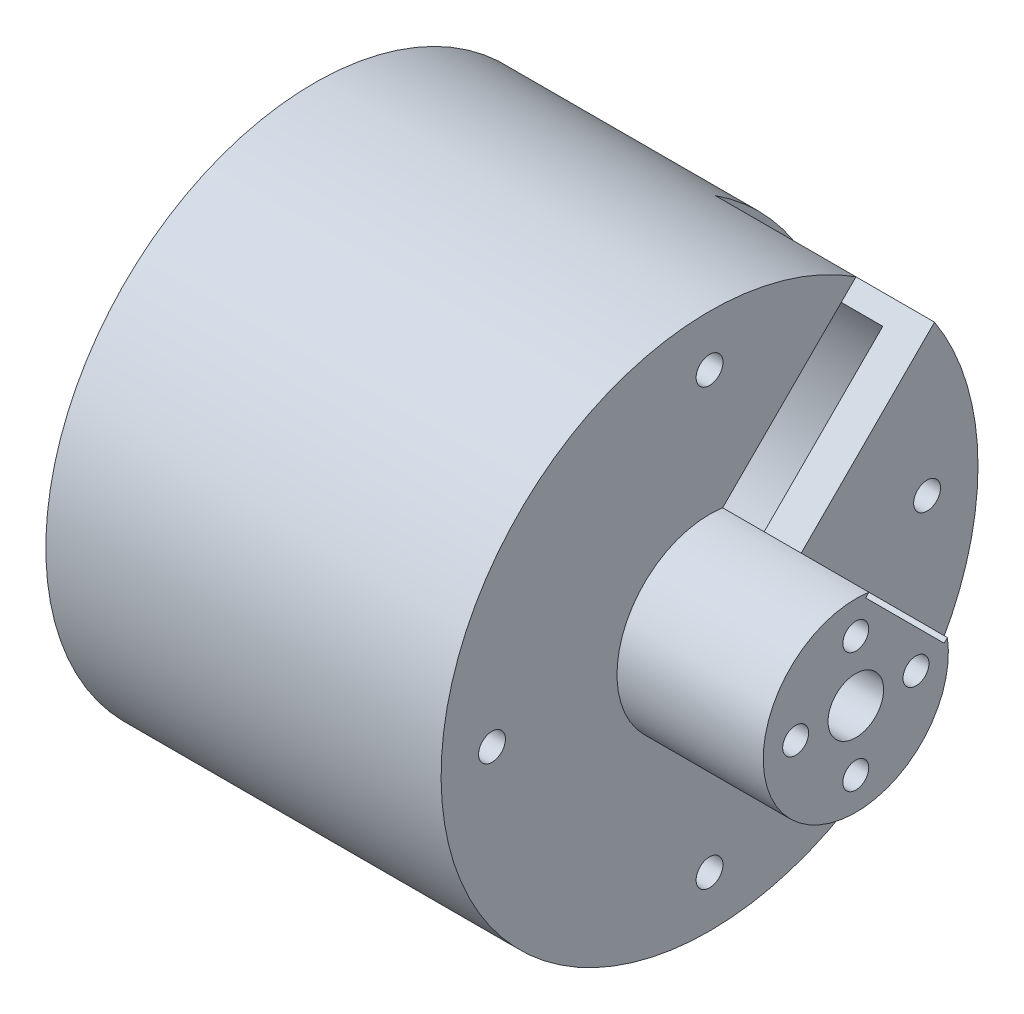
ISO-10303-21;
HEADER;
FILE_DESCRIPTION(('STEP AP214'),'2;1');
FILE_NAME('part.step','',(''),(''),'','','');
FILE_SCHEMA(('AUTOMOTIVE_DESIGN { 1 0 10303 214 1 1 1 1 }'));
ENDSEC;
DATA;
#1=APPLICATION_CONTEXT('core data for automotive mechanical design processes');
#2=APPLICATION_PROTOCOL_DEFINITION('international standard','automotive_design',2000,#1);
#3=PRODUCT_CONTEXT('',#1,'mechanical');
#4=PRODUCT('Part','Part','',(#3));
#5=PRODUCT_RELATED_PRODUCT_CATEGORY('part','',(#4));
#6=PRODUCT_DEFINITION_FORMATION('','',#4);
#7=PRODUCT_DEFINITION_CONTEXT('part definition',#1,'design');
#8=PRODUCT_DEFINITION('design','',#6,#7);
#9=PRODUCT_DEFINITION_SHAPE('','',#8);
#10=(LENGTH_UNIT() NAMED_UNIT(*) SI_UNIT(.MILLI.,.METRE.));
#11=(NAMED_UNIT(*) PLANE_ANGLE_UNIT() SI_UNIT($,.RADIAN.));
#12=(NAMED_UNIT(*) SI_UNIT($,.STERADIAN.) SOLID_ANGLE_UNIT());
#13=UNCERTAINTY_MEASURE_WITH_UNIT(LENGTH_MEASURE(1.E-05),#10,'distance_accuracy_value','');
#14=(GEOMETRIC_REPRESENTATION_CONTEXT(3) GLOBAL_UNCERTAINTY_ASSIGNED_CONTEXT((#13)) GLOBAL_UNIT_ASSIGNED_CONTEXT((#10,
#11,#12)) REPRESENTATION_CONTEXT('',''));
#15=CARTESIAN_POINT('',(0.,0.,0.));
#16=DIRECTION('',(0.,0.,1.));
#17=DIRECTION('',(1.,0.,0.));
#18=AXIS2_PLACEMENT_3D('',#15,#16,#17);
#19=CARTESIAN_POINT('',(-10.123,0.,0.));
#20=DIRECTION('',(-1.,0.,0.));
#21=DIRECTION('',(0.,0.,-1.));
#22=AXIS2_PLACEMENT_3D('',#19,#20,#21);
#23=CYLINDRICAL_SURFACE('',#22,26.8);
#24=CARTESIAN_POINT('',(-21.,0.,0.));
#25=DIRECTION('',(-1.,0.,0.));
#26=DIRECTION('',(0.,0.,1.));
#27=AXIS2_PLACEMENT_3D('',#24,#25,#26);
#28=CIRCLE('',#27,26.8);
#29=CARTESIAN_POINT('',(-21.,0.,26.8));
#30=VERTEX_POINT('',#29);
#31=EDGE_CURVE('E49',#30,#30,#28,.F.);
#32=ORIENTED_EDGE('',*,*,#31,.F.);
#33=EDGE_LOOP('',(#32));
#34=FACE_BOUND('',#33,.T.);
#35=DIRECTION('',(-1.,0.,0.));
#36=VECTOR('',#35,1.);
#37=CARTESIAN_POINT('',(-10.123,22.7120748961036,-14.226793521865));
#38=LINE('',#37,#36);
#39=CARTESIAN_POINT('',(6.,22.7120748961036,-14.226793521865));
#40=VERTEX_POINT('',#39);
#41=CARTESIAN_POINT('',(17.2,22.7120748961036,-14.226793521865));
#42=VERTEX_POINT('',#41);
#43=EDGE_CURVE('E127',#40,#42,#38,.F.);
#44=ORIENTED_EDGE('',*,*,#43,.T.);
#45=CARTESIAN_POINT('',(17.2,0.,0.));
#46=DIRECTION('',(1.,0.,0.));
#47=DIRECTION('',(0.,0.,-1.));
#48=AXIS2_PLACEMENT_3D('',#45,#46,#47);
#49=CIRCLE('',#48,26.8);
#50=CARTESIAN_POINT('',(17.2,14.226793521865,-22.7120748961036));
#51=VERTEX_POINT('',#50);
#52=EDGE_CURVE('E159',#42,#51,#49,.T.);
#53=ORIENTED_EDGE('',*,*,#52,.T.);
#54=DIRECTION('',(-1.,0.,0.));
#55=VECTOR('',#54,1.);
#56=CARTESIAN_POINT('',(-10.123,14.226793521865,-22.7120748961036));
#57=LINE('',#56,#55);
#58=CARTESIAN_POINT('',(6.,14.226793521865,-22.7120748961036));
#59=VERTEX_POINT('',#58);
#60=EDGE_CURVE('E228',#51,#59,#57,.T.);
#61=ORIENTED_EDGE('',*,*,#60,.T.);
#62=CARTESIAN_POINT('',(6.,0.,0.));
#63=DIRECTION('',(1.,0.,0.));
#64=DIRECTION('',(0.,0.,-1.));
#65=AXIS2_PLACEMENT_3D('',#62,#63,#64);
#66=CIRCLE('',#65,26.8);
#67=EDGE_CURVE('E114',#40,#59,#66,.F.);
#68=ORIENTED_EDGE('',*,*,#67,.F.);
#69=EDGE_LOOP('',(#44,#53,#61,#68));
#70=FACE_BOUND('',#69,.T.);
#71=ADVANCED_FACE('F41',(#34,#70),#23,.F.);
#72=CARTESIAN_POINT('',(-10.123,0.,0.));
#73=DIRECTION('',(-1.,0.,0.));
#74=DIRECTION('',(0.,0.,-1.));
#75=AXIS2_PLACEMENT_3D('',#72,#73,#74);
#76=CYLINDRICAL_SURFACE('',#75,29.);
#77=CARTESIAN_POINT('',(-21.5,0.,0.));
#78=DIRECTION('',(1.,0.,0.));
#79=DIRECTION('',(0.,0.,-1.));
#80=AXIS2_PLACEMENT_3D('',#77,#78,#79);
#81=CIRCLE('',#80,29.);
#82=CARTESIAN_POINT('',(-21.5,0.,-29.));
#83=VERTEX_POINT('',#82);
#84=EDGE_CURVE('E143',#83,#83,#81,.T.);
#85=ORIENTED_EDGE('',*,*,#84,.T.);
#86=EDGE_LOOP('',(#85));
#87=FACE_BOUND('',#86,.T.);
#88=DIRECTION('',(-1.,0.,0.));
#89=VECTOR('',#88,1.);
#90=CARTESIAN_POINT('',(-10.123,24.3050433348582,-15.8197619606196));
#91=LINE('',#90,#89);
#92=CARTESIAN_POINT('',(21.2,24.3050433348582,-15.8197619606196));
#93=VERTEX_POINT('',#92);
#94=CARTESIAN_POINT('',(6.,24.3050433348582,-15.8197619606196));
#95=VERTEX_POINT('',#94);
#96=EDGE_CURVE('E131',#93,#95,#91,.T.);
#97=ORIENTED_EDGE('',*,*,#96,.T.);
#98=CARTESIAN_POINT('',(6.,0.,0.));
#99=DIRECTION('',(1.,0.,0.));
#100=DIRECTION('',(0.,0.,-1.));
#101=AXIS2_PLACEMENT_3D('',#98,#99,#100);
#102=CIRCLE('',#101,29.);
#103=CARTESIAN_POINT('',(6.,15.8197619606196,-24.3050433348582));
#104=VERTEX_POINT('',#103);
#105=EDGE_CURVE('E111',#104,#95,#102,.T.);
#106=ORIENTED_EDGE('',*,*,#105,.F.);
#107=DIRECTION('',(-1.,0.,0.));
#108=VECTOR('',#107,1.);
#109=CARTESIAN_POINT('',(-10.123,15.8197619606196,-24.3050433348582));
#110=LINE('',#109,#108);
#111=CARTESIAN_POINT('',(21.2,15.8197619606196,-24.3050433348582));
#112=VERTEX_POINT('',#111);
#113=EDGE_CURVE('E120',#104,#112,#110,.F.);
#114=ORIENTED_EDGE('',*,*,#113,.T.);
#115=CARTESIAN_POINT('',(21.2,0.,0.));
#116=DIRECTION('',(1.,0.,0.));
#117=DIRECTION('',(0.,0.,-1.));
#118=AXIS2_PLACEMENT_3D('',#115,#116,#117);
#119=CIRCLE('',#118,29.);
#120=EDGE_CURVE('E146',#93,#112,#119,.T.);
#121=ORIENTED_EDGE('',*,*,#120,.F.);
#122=EDGE_LOOP('',(#97,#106,#114,#121));
#123=FACE_BOUND('',#122,.T.);
#124=ADVANCED_FACE('F129',(#87,#123),#76,.T.);
#125=CARTESIAN_POINT('',(21.2,29.,0.));
#126=DIRECTION('',(-1.,0.,0.));
#127=DIRECTION('',(0.,0.,-1.));
#128=AXIS2_PLACEMENT_3D('',#125,#126,#127);
#129=PLANE('',#128);
#130=CARTESIAN_POINT('',(21.2,0.,-23.5));
#131=DIRECTION('',(-1.,0.,0.));
#132=DIRECTION('',(0.,0.,1.));
#133=AXIS2_PLACEMENT_3D('',#130,#131,#132);
#134=CIRCLE('',#133,1.45);
#135=CARTESIAN_POINT('',(21.2,0.,-22.05));
#136=VERTEX_POINT('',#135);
#137=EDGE_CURVE('E163',#136,#136,#134,.T.);
#138=ORIENTED_EDGE('',*,*,#137,.T.);
#139=EDGE_LOOP('',(#138));
#140=FACE_BOUND('',#139,.T.);
#141=CARTESIAN_POINT('',(21.2,23.5,-3.33955085807247E-13));
#142=DIRECTION('',(-1.,0.,0.));
#143=DIRECTION('',(0.,-1.,0.));
#144=AXIS2_PLACEMENT_3D('',#141,#142,#143);
#145=CIRCLE('',#144,1.45);
#146=CARTESIAN_POINT('',(21.2,22.05,-3.18767141983279E-13));
#147=VERTEX_POINT('',#146);
#148=EDGE_CURVE('E169',#147,#147,#145,.T.);
#149=ORIENTED_EDGE('',*,*,#148,.T.);
#150=EDGE_LOOP('',(#149));
#151=FACE_BOUND('',#150,.T.);
#152=CARTESIAN_POINT('',(21.2,0.,23.5));
#153=DIRECTION('',(-1.,0.,0.));
#154=DIRECTION('',(0.,0.,-1.));
#155=AXIS2_PLACEMENT_3D('',#152,#153,#154);
#156=CIRCLE('',#155,1.45);
#157=CARTESIAN_POINT('',(21.2,0.,22.05));
#158=VERTEX_POINT('',#157);
#159=EDGE_CURVE('E176',#158,#158,#156,.T.);
#160=ORIENTED_EDGE('',*,*,#159,.T.);
#161=EDGE_LOOP('',(#160));
#162=FACE_BOUND('',#161,.T.);
#163=CARTESIAN_POINT('',(21.2,-23.5,1.6985546288162E-13));
#164=DIRECTION('',(-1.,0.,0.));
#165=DIRECTION('',(0.,1.,0.));
#166=AXIS2_PLACEMENT_3D('',#163,#164,#165);
#167=CIRCLE('',#166,1.45);
#168=CARTESIAN_POINT('',(21.2,-22.05,1.64792814940297E-13));
#169=VERTEX_POINT('',#168);
#170=EDGE_CURVE('E182',#169,#169,#167,.T.);
#171=ORIENTED_EDGE('',*,*,#170,.T.);
#172=EDGE_LOOP('',(#171));
#173=FACE_BOUND('',#172,.T.);
#174=DIRECTION('',(0.,0.707106781186548,-0.707106781186548));
#175=VECTOR('',#174,1.);
#176=CARTESIAN_POINT('',(21.2,18.7426406871193,-10.2573593128807));
#177=LINE('',#176,#175);
#178=CARTESIAN_POINT('',(21.2,9.89949493661167,-1.4142135623731));
#179=VERTEX_POINT('',#178);
#180=EDGE_CURVE('E215',#179,#93,#177,.T.);
#181=ORIENTED_EDGE('',*,*,#180,.T.);
#182=ORIENTED_EDGE('',*,*,#120,.T.);
#183=DIRECTION('',(0.,-0.707106781186548,0.707106781186547));
#184=VECTOR('',#183,1.);
#185=CARTESIAN_POINT('',(21.2,10.2573593128807,-18.7426406871193));
#186=LINE('',#185,#184);
#187=CARTESIAN_POINT('',(21.2,1.41421356237309,-9.89949493661167));
#188=VERTEX_POINT('',#187);
#189=EDGE_CURVE('E123',#112,#188,#186,.T.);
#190=ORIENTED_EDGE('',*,*,#189,.T.);
#191=CARTESIAN_POINT('',(21.2,0.,0.));
#192=DIRECTION('',(1.,0.,0.));
#193=DIRECTION('',(0.,0.,-1.));
#194=AXIS2_PLACEMENT_3D('',#191,#192,#193);
#195=CIRCLE('',#194,10.);
#196=EDGE_CURVE('E148',#179,#188,#195,.T.);
#197=ORIENTED_EDGE('',*,*,#196,.F.);
#198=EDGE_LOOP('',(#181,#182,#190,#197));
#199=FACE_BOUND('',#198,.T.);
#200=ADVANCED_FACE('F251',(#140,#151,#162,#173,#199),#129,.F.);
#201=CARTESIAN_POINT('',(-10.123,0.,0.));
#202=DIRECTION('',(-1.,0.,0.));
#203=DIRECTION('',(0.,0.,-1.));
#204=AXIS2_PLACEMENT_3D('',#201,#202,#203);
#205=CYLINDRICAL_SURFACE('',#204,10.);
#206=DIRECTION('',(-1.,0.,0.));
#207=VECTOR('',#206,1.);
#208=CARTESIAN_POINT('',(-10.123,9.89949493661167,-1.4142135623731));
#209=LINE('',#208,#207);
#210=CARTESIAN_POINT('',(37.,9.89949493661167,-1.4142135623731));
#211=VERTEX_POINT('',#210);
#212=EDGE_CURVE('E217',#211,#179,#209,.T.);
#213=ORIENTED_EDGE('',*,*,#212,.T.);
#214=ORIENTED_EDGE('',*,*,#196,.T.);
#215=DIRECTION('',(-1.,0.,0.));
#216=VECTOR('',#215,1.);
#217=CARTESIAN_POINT('',(-10.123,1.41421356237309,-9.89949493661167));
#218=LINE('',#217,#216);
#219=CARTESIAN_POINT('',(37.,1.41421356237309,-9.89949493661167));
#220=VERTEX_POINT('',#219);
#221=EDGE_CURVE('E224',#188,#220,#218,.F.);
#222=ORIENTED_EDGE('',*,*,#221,.T.);
#223=CARTESIAN_POINT('',(37.,0.,0.));
#224=DIRECTION('',(1.,0.,0.));
#225=DIRECTION('',(0.,0.,-1.));
#226=AXIS2_PLACEMENT_3D('',#223,#224,#225);
#227=CIRCLE('',#226,10.);
#228=EDGE_CURVE('E151',#211,#220,#227,.T.);
#229=ORIENTED_EDGE('',*,*,#228,.F.);
#230=EDGE_LOOP('',(#213,#214,#222,#229));
#231=FACE_BOUND('',#230,.T.);
#232=ADVANCED_FACE('F249',(#231),#205,.T.);
#233=CARTESIAN_POINT('',(37.,10.,0.));
#234=DIRECTION('',(-1.,0.,0.));
#235=DIRECTION('',(0.,0.,-1.));
#236=AXIS2_PLACEMENT_3D('',#233,#234,#235);
#237=PLANE('',#236);
#238=CARTESIAN_POINT('',(37.,0.,0.));
#239=DIRECTION('',(1.,0.,0.));
#240=DIRECTION('',(0.,0.,-1.));
#241=AXIS2_PLACEMENT_3D('',#238,#239,#240);
#242=CIRCLE('',#241,3.);
#243=CARTESIAN_POINT('',(37.,0.,-3.));
#244=VERTEX_POINT('',#243);
#245=EDGE_CURVE('E153',#244,#244,#242,.T.);
#246=ORIENTED_EDGE('',*,*,#245,.F.);
#247=EDGE_LOOP('',(#246));
#248=FACE_BOUND('',#247,.T.);
#249=CARTESIAN_POINT('',(37.,0.,-6.5));
#250=DIRECTION('',(-1.,0.,0.));
#251=DIRECTION('',(0.,0.,1.));
#252=AXIS2_PLACEMENT_3D('',#249,#250,#251);
#253=CIRCLE('',#252,1.4);
#254=CARTESIAN_POINT('',(37.,0.,-5.1));
#255=VERTEX_POINT('',#254);
#256=EDGE_CURVE('E187',#255,#255,#253,.T.);
#257=ORIENTED_EDGE('',*,*,#256,.T.);
#258=EDGE_LOOP('',(#257));
#259=FACE_BOUND('',#258,.T.);
#260=CARTESIAN_POINT('',(37.,6.5,0.));
#261=DIRECTION('',(-1.,0.,0.));
#262=DIRECTION('',(0.,-1.,0.));
#263=AXIS2_PLACEMENT_3D('',#260,#261,#262);
#264=CIRCLE('',#263,1.4);
#265=CARTESIAN_POINT('',(37.,5.1,0.));
#266=VERTEX_POINT('',#265);
#267=EDGE_CURVE('E193',#266,#266,#264,.T.);
#268=ORIENTED_EDGE('',*,*,#267,.T.);
#269=EDGE_LOOP('',(#268));
#270=FACE_BOUND('',#269,.T.);
#271=CARTESIAN_POINT('',(37.,0.,6.5));
#272=DIRECTION('',(-1.,0.,0.));
#273=DIRECTION('',(0.,0.,-1.));
#274=AXIS2_PLACEMENT_3D('',#271,#272,#273);
#275=CIRCLE('',#274,1.4);
#276=CARTESIAN_POINT('',(37.,0.,5.1));
#277=VERTEX_POINT('',#276);
#278=EDGE_CURVE('E199',#277,#277,#275,.T.);
#279=ORIENTED_EDGE('',*,*,#278,.T.);
#280=EDGE_LOOP('',(#279));
#281=FACE_BOUND('',#280,.T.);
#282=CARTESIAN_POINT('',(37.,-6.5,0.));
#283=DIRECTION('',(-1.,0.,0.));
#284=DIRECTION('',(0.,1.,0.));
#285=AXIS2_PLACEMENT_3D('',#282,#283,#284);
#286=CIRCLE('',#285,1.4);
#287=CARTESIAN_POINT('',(37.,-5.1,0.));
#288=VERTEX_POINT('',#287);
#289=EDGE_CURVE('E205',#288,#288,#286,.T.);
#290=ORIENTED_EDGE('',*,*,#289,.T.);
#291=EDGE_LOOP('',(#290));
#292=FACE_BOUND('',#291,.T.);
#293=DIRECTION('',(0.,0.707106781186548,-0.707106781186548));
#294=VECTOR('',#293,1.);
#295=CARTESIAN_POINT('',(37.,9.24264068711928,-0.757359312880718));
#296=LINE('',#295,#294);
#297=CARTESIAN_POINT('',(37.,9.54594154601839,-1.06066017177982));
#298=VERTEX_POINT('',#297);
#299=EDGE_CURVE('E219',#298,#211,#296,.T.);
#300=ORIENTED_EDGE('',*,*,#299,.T.);
#301=ORIENTED_EDGE('',*,*,#228,.T.);
#302=DIRECTION('',(0.,-0.707106781186548,0.707106781186547));
#303=VECTOR('',#302,1.);
#304=CARTESIAN_POINT('',(37.,0.757359312880715,-9.24264068711929));
#305=LINE('',#304,#303);
#306=CARTESIAN_POINT('',(37.,1.06066017177982,-9.54594154601839));
#307=VERTEX_POINT('',#306);
#308=EDGE_CURVE('E56',#220,#307,#305,.T.);
#309=ORIENTED_EDGE('',*,*,#308,.T.);
#310=DIRECTION('',(0.,0.707106781186548,0.707106781186548));
#311=VECTOR('',#310,1.);
#312=CARTESIAN_POINT('',(37.,10.3033008588991,-0.303300858899107));
#313=LINE('',#312,#311);
#314=EDGE_CURVE('E211',#307,#298,#313,.T.);
#315=ORIENTED_EDGE('',*,*,#314,.T.);
#316=EDGE_LOOP('',(#300,#301,#309,#315));
#317=FACE_BOUND('',#316,.T.);
#318=ADVANCED_FACE('F244',(#248,#259,#270,#281,#292,#317),#237,.F.);
#319=CARTESIAN_POINT('',(17.2,3.,0.));
#320=DIRECTION('',(1.,0.,0.));
#321=DIRECTION('',(0.,0.,1.));
#322=AXIS2_PLACEMENT_3D('',#319,#320,#321);
#323=PLANE('',#322);
#324=CARTESIAN_POINT('',(17.2,0.,0.));
#325=DIRECTION('',(1.,0.,0.));
#326=DIRECTION('',(0.,0.,-1.));
#327=AXIS2_PLACEMENT_3D('',#324,#325,#326);
#328=CIRCLE('',#327,3.);
#329=CARTESIAN_POINT('',(17.2,0.,-3.));
#330=VERTEX_POINT('',#329);
#331=EDGE_CURVE('E156',#330,#330,#328,.T.);
#332=ORIENTED_EDGE('',*,*,#331,.T.);
#333=EDGE_LOOP('',(#332));
#334=FACE_BOUND('',#333,.T.);
#335=CARTESIAN_POINT('',(17.2,0.,-23.5));
#336=DIRECTION('',(-1.,0.,0.));
#337=DIRECTION('',(0.,0.,1.));
#338=AXIS2_PLACEMENT_3D('',#335,#336,#337);
#339=CIRCLE('',#338,1.45);
#340=CARTESIAN_POINT('',(17.2,0.,-22.05));
#341=VERTEX_POINT('',#340);
#342=EDGE_CURVE('E162',#341,#341,#339,.T.);
#343=ORIENTED_EDGE('',*,*,#342,.F.);
#344=EDGE_LOOP('',(#343));
#345=FACE_BOUND('',#344,.T.);
#346=CARTESIAN_POINT('',(17.2,23.5,-3.33955085807247E-13));
#347=DIRECTION('',(-1.,0.,0.));
#348=DIRECTION('',(0.,-1.,0.));
#349=AXIS2_PLACEMENT_3D('',#346,#347,#348);
#350=CIRCLE('',#349,1.45);
#351=CARTESIAN_POINT('',(17.2,22.05,-3.18767141983279E-13));
#352=VERTEX_POINT('',#351);
#353=EDGE_CURVE('E172',#352,#352,#350,.T.);
#354=ORIENTED_EDGE('',*,*,#353,.F.);
#355=EDGE_LOOP('',(#354));
#356=FACE_BOUND('',#355,.T.);
#357=CARTESIAN_POINT('',(17.2,0.,23.5));
#358=DIRECTION('',(-1.,0.,0.));
#359=DIRECTION('',(0.,0.,-1.));
#360=AXIS2_PLACEMENT_3D('',#357,#358,#359);
#361=CIRCLE('',#360,1.45);
#362=CARTESIAN_POINT('',(17.2,0.,22.05));
#363=VERTEX_POINT('',#362);
#364=EDGE_CURVE('E179',#363,#363,#361,.T.);
#365=ORIENTED_EDGE('',*,*,#364,.F.);
#366=EDGE_LOOP('',(#365));
#367=FACE_BOUND('',#366,.T.);
#368=CARTESIAN_POINT('',(17.2,-23.5,1.6985546288162E-13));
#369=DIRECTION('',(-1.,0.,0.));
#370=DIRECTION('',(0.,1.,0.));
#371=AXIS2_PLACEMENT_3D('',#368,#369,#370);
#372=CIRCLE('',#371,1.45);
#373=CARTESIAN_POINT('',(17.2,-22.05,1.64792814940297E-13));
#374=VERTEX_POINT('',#373);
#375=EDGE_CURVE('E166',#374,#374,#372,.T.);
#376=ORIENTED_EDGE('',*,*,#375,.F.);
#377=EDGE_LOOP('',(#376));
#378=FACE_BOUND('',#377,.T.);
#379=DIRECTION('',(0.,-0.707106781186548,0.707106781186548));
#380=VECTOR('',#379,1.);
#381=CARTESIAN_POINT('',(17.2,5.74264068711928,2.74264068711928));
#382=LINE('',#381,#380);
#383=CARTESIAN_POINT('',(17.2,9.54594154601839,-1.06066017177982));
#384=VERTEX_POINT('',#383);
#385=EDGE_CURVE('E132',#42,#384,#382,.T.);
#386=ORIENTED_EDGE('',*,*,#385,.T.);
#387=DIRECTION('',(0.,-0.707106781186548,-0.707106781186548));
#388=VECTOR('',#387,1.);
#389=CARTESIAN_POINT('',(17.2,6.80330085889911,-3.80330085889911));
#390=LINE('',#389,#388);
#391=CARTESIAN_POINT('',(17.2,1.06066017177982,-9.54594154601839));
#392=VERTEX_POINT('',#391);
#393=EDGE_CURVE('E136',#384,#392,#390,.T.);
#394=ORIENTED_EDGE('',*,*,#393,.T.);
#395=DIRECTION('',(0.,0.707106781186548,-0.707106781186547));
#396=VECTOR('',#395,1.);
#397=CARTESIAN_POINT('',(17.2,-2.74264068711929,-5.74264068711929));
#398=LINE('',#397,#396);
#399=EDGE_CURVE('E141',#392,#51,#398,.T.);
#400=ORIENTED_EDGE('',*,*,#399,.T.);
#401=ORIENTED_EDGE('',*,*,#52,.F.);
#402=EDGE_LOOP('',(#386,#394,#400,#401));
#403=FACE_BOUND('',#402,.T.);
#404=ADVANCED_FACE('F240',(#334,#345,#356,#367,#378,#403),#323,.F.);
#405=CARTESIAN_POINT('',(-21.5,26.8,0.));
#406=DIRECTION('',(1.,0.,0.));
#407=DIRECTION('',(0.,0.,1.));
#408=AXIS2_PLACEMENT_3D('',#405,#406,#407);
#409=PLANE('',#408);
#410=CARTESIAN_POINT('',(-21.5,0.,0.));
#411=DIRECTION('',(-1.,0.,0.));
#412=DIRECTION('',(0.,0.,1.));
#413=AXIS2_PLACEMENT_3D('',#410,#411,#412);
#414=CIRCLE('',#413,27.3);
#415=CARTESIAN_POINT('',(-21.5,0.,27.3));
#416=VERTEX_POINT('',#415);
#417=EDGE_CURVE('E11',#416,#416,#414,.T.);
#418=ORIENTED_EDGE('',*,*,#417,.F.);
#419=EDGE_LOOP('',(#418));
#420=FACE_BOUND('',#419,.T.);
#421=ORIENTED_EDGE('',*,*,#84,.F.);
#422=EDGE_LOOP('',(#421));
#423=FACE_BOUND('',#422,.T.);
#424=ADVANCED_FACE('F269',(#420,#423),#409,.F.);
#425=CARTESIAN_POINT('',(-10.123,0.,0.));
#426=DIRECTION('',(-1.,0.,0.));
#427=DIRECTION('',(0.,0.,-1.));
#428=AXIS2_PLACEMENT_3D('',#425,#426,#427);
#429=CYLINDRICAL_SURFACE('',#428,3.);
#430=ORIENTED_EDGE('',*,*,#245,.T.);
#431=EDGE_LOOP('',(#430));
#432=FACE_BOUND('',#431,.T.);
#433=ORIENTED_EDGE('',*,*,#331,.F.);
#434=EDGE_LOOP('',(#433));
#435=FACE_BOUND('',#434,.T.);
#436=ADVANCED_FACE('F271',(#432,#435),#429,.F.);
#437=CARTESIAN_POINT('',(17.2,0.,-23.5));
#438=DIRECTION('',(1.,0.,0.));
#439=DIRECTION('',(0.,0.,1.));
#440=AXIS2_PLACEMENT_3D('',#437,#438,#439);
#441=CYLINDRICAL_SURFACE('',#440,1.45);
#442=ORIENTED_EDGE('',*,*,#342,.T.);
#443=EDGE_LOOP('',(#442));
#444=FACE_BOUND('',#443,.T.);
#445=ORIENTED_EDGE('',*,*,#137,.F.);
#446=EDGE_LOOP('',(#445));
#447=FACE_BOUND('',#446,.T.);
#448=ADVANCED_FACE('F277',(#444,#447),#441,.F.);
#449=CARTESIAN_POINT('',(17.2,23.5,-3.33955085807247E-13));
#450=DIRECTION('',(1.,0.,0.));
#451=DIRECTION('',(0.,0.,1.));
#452=AXIS2_PLACEMENT_3D('',#449,#450,#451);
#453=CYLINDRICAL_SURFACE('',#452,1.45);
#454=ORIENTED_EDGE('',*,*,#353,.T.);
#455=EDGE_LOOP('',(#454));
#456=FACE_BOUND('',#455,.T.);
#457=ORIENTED_EDGE('',*,*,#148,.F.);
#458=EDGE_LOOP('',(#457));
#459=FACE_BOUND('',#458,.T.);
#460=ADVANCED_FACE('F339',(#456,#459),#453,.F.);
#461=CARTESIAN_POINT('',(17.2,0.,23.5));
#462=DIRECTION('',(1.,0.,0.));
#463=DIRECTION('',(0.,0.,1.));
#464=AXIS2_PLACEMENT_3D('',#461,#462,#463);
#465=CYLINDRICAL_SURFACE('',#464,1.45);
#466=ORIENTED_EDGE('',*,*,#364,.T.);
#467=EDGE_LOOP('',(#466));
#468=FACE_BOUND('',#467,.T.);
#469=ORIENTED_EDGE('',*,*,#159,.F.);
#470=EDGE_LOOP('',(#469));
#471=FACE_BOUND('',#470,.T.);
#472=ADVANCED_FACE('F335',(#468,#471),#465,.F.);
#473=CARTESIAN_POINT('',(17.2,-23.5,1.6985546288162E-13));
#474=DIRECTION('',(1.,0.,0.));
#475=DIRECTION('',(0.,0.,1.));
#476=AXIS2_PLACEMENT_3D('',#473,#474,#475);
#477=CYLINDRICAL_SURFACE('',#476,1.45);
#478=ORIENTED_EDGE('',*,*,#375,.T.);
#479=EDGE_LOOP('',(#478));
#480=FACE_BOUND('',#479,.T.);
#481=ORIENTED_EDGE('',*,*,#170,.F.);
#482=EDGE_LOOP('',(#481));
#483=FACE_BOUND('',#482,.T.);
#484=ADVANCED_FACE('F331',(#480,#483),#477,.F.);
#485=CARTESIAN_POINT('',(25.,0.,-6.5));
#486=DIRECTION('',(1.,0.,0.));
#487=DIRECTION('',(0.,0.,1.));
#488=AXIS2_PLACEMENT_3D('',#485,#486,#487);
#489=CYLINDRICAL_SURFACE('',#488,1.4);
#490=CARTESIAN_POINT('',(25.,0.,-6.5));
#491=DIRECTION('',(-1.,0.,0.));
#492=DIRECTION('',(0.,0.,1.));
#493=AXIS2_PLACEMENT_3D('',#490,#491,#492);
#494=CIRCLE('',#493,1.4);
#495=CARTESIAN_POINT('',(25.,0.,-5.1));
#496=VERTEX_POINT('',#495);
#497=EDGE_CURVE('E173',#496,#496,#494,.T.);
#498=ORIENTED_EDGE('',*,*,#497,.T.);
#499=EDGE_LOOP('',(#498));
#500=FACE_BOUND('',#499,.T.);
#501=ORIENTED_EDGE('',*,*,#256,.F.);
#502=EDGE_LOOP('',(#501));
#503=FACE_BOUND('',#502,.T.);
#504=ADVANCED_FACE('F327',(#500,#503),#489,.F.);
#505=CARTESIAN_POINT('',(25.,0.,-6.5));
#506=DIRECTION('',(1.,0.,0.));
#507=DIRECTION('',(0.,0.,1.));
#508=AXIS2_PLACEMENT_3D('',#505,#506,#507);
#509=PLANE('',#508);
#510=ORIENTED_EDGE('',*,*,#497,.F.);
#511=EDGE_LOOP('',(#510));
#512=FACE_BOUND('',#511,.T.);
#513=ADVANCED_FACE('F323',(#512),#509,.T.);
#514=CARTESIAN_POINT('',(25.,6.5,0.));
#515=DIRECTION('',(1.,0.,0.));
#516=DIRECTION('',(0.,0.,1.));
#517=AXIS2_PLACEMENT_3D('',#514,#515,#516);
#518=CYLINDRICAL_SURFACE('',#517,1.4);
#519=CARTESIAN_POINT('',(25.,6.5,0.));
#520=DIRECTION('',(-1.,0.,0.));
#521=DIRECTION('',(0.,-1.,0.));
#522=AXIS2_PLACEMENT_3D('',#519,#520,#521);
#523=CIRCLE('',#522,1.4);
#524=CARTESIAN_POINT('',(25.,5.1,0.));
#525=VERTEX_POINT('',#524);
#526=EDGE_CURVE('E196',#525,#525,#523,.T.);
#527=ORIENTED_EDGE('',*,*,#526,.T.);
#528=EDGE_LOOP('',(#527));
#529=FACE_BOUND('',#528,.T.);
#530=ORIENTED_EDGE('',*,*,#267,.F.);
#531=EDGE_LOOP('',(#530));
#532=FACE_BOUND('',#531,.T.);
#533=ADVANCED_FACE('F319',(#529,#532),#518,.F.);
#534=CARTESIAN_POINT('',(25.,6.5,0.));
#535=DIRECTION('',(1.,0.,0.));
#536=DIRECTION('',(0.,-1.,0.));
#537=AXIS2_PLACEMENT_3D('',#534,#535,#536);
#538=PLANE('',#537);
#539=ORIENTED_EDGE('',*,*,#526,.F.);
#540=EDGE_LOOP('',(#539));
#541=FACE_BOUND('',#540,.T.);
#542=ADVANCED_FACE('F315',(#541),#538,.T.);
#543=CARTESIAN_POINT('',(25.,0.,6.5));
#544=DIRECTION('',(1.,0.,0.));
#545=DIRECTION('',(0.,0.,1.));
#546=AXIS2_PLACEMENT_3D('',#543,#544,#545);
#547=CYLINDRICAL_SURFACE('',#546,1.4);
#548=CARTESIAN_POINT('',(25.,0.,6.5));
#549=DIRECTION('',(-1.,0.,0.));
#550=DIRECTION('',(0.,0.,-1.));
#551=AXIS2_PLACEMENT_3D('',#548,#549,#550);
#552=CIRCLE('',#551,1.4);
#553=CARTESIAN_POINT('',(25.,0.,5.1));
#554=VERTEX_POINT('',#553);
#555=EDGE_CURVE('E202',#554,#554,#552,.T.);
#556=ORIENTED_EDGE('',*,*,#555,.T.);
#557=EDGE_LOOP('',(#556));
#558=FACE_BOUND('',#557,.T.);
#559=ORIENTED_EDGE('',*,*,#278,.F.);
#560=EDGE_LOOP('',(#559));
#561=FACE_BOUND('',#560,.T.);
#562=ADVANCED_FACE('F311',(#558,#561),#547,.F.);
#563=CARTESIAN_POINT('',(25.,0.,6.5));
#564=DIRECTION('',(1.,0.,0.));
#565=DIRECTION('',(0.,0.,-1.));
#566=AXIS2_PLACEMENT_3D('',#563,#564,#565);
#567=PLANE('',#566);
#568=ORIENTED_EDGE('',*,*,#555,.F.);
#569=EDGE_LOOP('',(#568));
#570=FACE_BOUND('',#569,.T.);
#571=ADVANCED_FACE('F307',(#570),#567,.T.);
#572=CARTESIAN_POINT('',(25.,-6.5,0.));
#573=DIRECTION('',(1.,0.,0.));
#574=DIRECTION('',(0.,0.,1.));
#575=AXIS2_PLACEMENT_3D('',#572,#573,#574);
#576=CYLINDRICAL_SURFACE('',#575,1.4);
#577=CARTESIAN_POINT('',(25.,-6.5,0.));
#578=DIRECTION('',(-1.,0.,0.));
#579=DIRECTION('',(0.,1.,0.));
#580=AXIS2_PLACEMENT_3D('',#577,#578,#579);
#581=CIRCLE('',#580,1.4);
#582=CARTESIAN_POINT('',(25.,-5.1,0.));
#583=VERTEX_POINT('',#582);
#584=EDGE_CURVE('E190',#583,#583,#581,.T.);
#585=ORIENTED_EDGE('',*,*,#584,.T.);
#586=EDGE_LOOP('',(#585));
#587=FACE_BOUND('',#586,.T.);
#588=ORIENTED_EDGE('',*,*,#289,.F.);
#589=EDGE_LOOP('',(#588));
#590=FACE_BOUND('',#589,.T.);
#591=ADVANCED_FACE('F303',(#587,#590),#576,.F.);
#592=CARTESIAN_POINT('',(25.,-6.5,0.));
#593=DIRECTION('',(1.,0.,0.));
#594=DIRECTION('',(0.,1.,0.));
#595=AXIS2_PLACEMENT_3D('',#592,#593,#594);
#596=PLANE('',#595);
#597=ORIENTED_EDGE('',*,*,#584,.F.);
#598=EDGE_LOOP('',(#597));
#599=FACE_BOUND('',#598,.T.);
#600=ADVANCED_FACE('F300',(#599),#596,.T.);
#601=CARTESIAN_POINT('',(6.,0.,0.));
#602=DIRECTION('',(-1.,0.,0.));
#603=DIRECTION('',(0.,0.,-1.));
#604=AXIS2_PLACEMENT_3D('',#601,#602,#603);
#605=PLANE('',#604);
#606=DIRECTION('',(0.,0.707106781186548,-0.707106781186548));
#607=VECTOR('',#606,1.);
#608=CARTESIAN_POINT('',(6.,28.9913780286484,-20.5060966544099));
#609=LINE('',#608,#607);
#610=EDGE_CURVE('E117',#40,#95,#609,.T.);
#611=ORIENTED_EDGE('',*,*,#610,.F.);
#612=ORIENTED_EDGE('',*,*,#67,.T.);
#613=DIRECTION('',(0.,-0.707106781186548,0.707106781186547));
#614=VECTOR('',#613,1.);
#615=CARTESIAN_POINT('',(6.,1.06066017177982,-9.54594154601839));
#616=LINE('',#615,#614);
#617=EDGE_CURVE('E107',#104,#59,#616,.T.);
#618=ORIENTED_EDGE('',*,*,#617,.F.);
#619=ORIENTED_EDGE('',*,*,#105,.T.);
#620=EDGE_LOOP('',(#611,#612,#618,#619));
#621=FACE_BOUND('',#620,.T.);
#622=ADVANCED_FACE('F109',(#621),#605,.F.);
#623=CARTESIAN_POINT('',(37.1,9.54594154601839,-1.06066017177982));
#624=DIRECTION('',(0.,0.707106781186548,-0.707106781186548));
#625=DIRECTION('',(0.,-0.707106781186548,-0.707106781186548));
#626=AXIS2_PLACEMENT_3D('',#623,#624,#625);
#627=PLANE('',#626);
#628=ORIENTED_EDGE('',*,*,#314,.F.);
#629=DIRECTION('',(-1.,0.,0.));
#630=VECTOR('',#629,1.);
#631=CARTESIAN_POINT('',(37.1,1.06066017177982,-9.54594154601839));
#632=LINE('',#631,#630);
#633=EDGE_CURVE('E63',#307,#392,#632,.T.);
#634=ORIENTED_EDGE('',*,*,#633,.T.);
#635=ORIENTED_EDGE('',*,*,#393,.F.);
#636=DIRECTION('',(-1.,0.,0.));
#637=VECTOR('',#636,1.);
#638=CARTESIAN_POINT('',(37.1,9.54594154601839,-1.06066017177982));
#639=LINE('',#638,#637);
#640=EDGE_CURVE('E230',#298,#384,#639,.T.);
#641=ORIENTED_EDGE('',*,*,#640,.F.);
#642=EDGE_LOOP('',(#628,#634,#635,#641));
#643=FACE_BOUND('',#642,.T.);
#644=ADVANCED_FACE('F241',(#643),#627,.T.);
#645=CARTESIAN_POINT('',(37.1,28.9913780286484,-20.5060966544099));
#646=DIRECTION('',(0.,-0.707106781186548,-0.707106781186548));
#647=DIRECTION('',(0.,-0.707106781186548,0.707106781186548));
#648=AXIS2_PLACEMENT_3D('',#645,#646,#647);
#649=PLANE('',#648);
#650=ORIENTED_EDGE('',*,*,#96,.F.);
#651=ORIENTED_EDGE('',*,*,#180,.F.);
#652=ORIENTED_EDGE('',*,*,#212,.F.);
#653=ORIENTED_EDGE('',*,*,#299,.F.);
#654=ORIENTED_EDGE('',*,*,#640,.T.);
#655=ORIENTED_EDGE('',*,*,#385,.F.);
#656=ORIENTED_EDGE('',*,*,#43,.F.);
#657=ORIENTED_EDGE('',*,*,#610,.T.);
#658=EDGE_LOOP('',(#650,#651,#652,#653,#654,#655,#656,#657));
#659=FACE_BOUND('',#658,.T.);
#660=ADVANCED_FACE('F235',(#659),#649,.T.);
#661=CARTESIAN_POINT('',(37.1,1.06066017177982,-9.54594154601839));
#662=DIRECTION('',(0.,0.707106781186547,0.707106781186548));
#663=DIRECTION('',(0.,0.707106781186548,-0.707106781186547));
#664=AXIS2_PLACEMENT_3D('',#661,#662,#663);
#665=PLANE('',#664);
#666=ORIENTED_EDGE('',*,*,#113,.F.);
#667=ORIENTED_EDGE('',*,*,#617,.T.);
#668=ORIENTED_EDGE('',*,*,#60,.F.);
#669=ORIENTED_EDGE('',*,*,#399,.F.);
#670=ORIENTED_EDGE('',*,*,#633,.F.);
#671=ORIENTED_EDGE('',*,*,#308,.F.);
#672=ORIENTED_EDGE('',*,*,#221,.F.);
#673=ORIENTED_EDGE('',*,*,#189,.F.);
#674=EDGE_LOOP('',(#666,#667,#668,#669,#670,#671,#672,#673));
#675=FACE_BOUND('',#674,.T.);
#676=ADVANCED_FACE('F121',(#675),#665,.T.);
#677=CARTESIAN_POINT('',(-21.,0.,0.));
#678=DIRECTION('',(-1.,0.,0.));
#679=DIRECTION('',(0.,0.,-1.));
#680=AXIS2_PLACEMENT_3D('',#677,#678,#679);
#681=CONICAL_SURFACE('',#680,26.8,0.785398163397448);
#682=ORIENTED_EDGE('',*,*,#417,.T.);
#683=EDGE_LOOP('',(#682));
#684=FACE_BOUND('',#683,.T.);
#685=ORIENTED_EDGE('',*,*,#31,.T.);
#686=EDGE_LOOP('',(#685));
#687=FACE_BOUND('',#686,.T.);
#688=ADVANCED_FACE('F43',(#684,#687),#681,.F.);
#689=CLOSED_SHELL('',(#71,#124,#200,#232,#318,#404,#424,#436,#448,#460,#472,#484,#504,#513,#533,
#542,#562,#571,#591,#600,#622,#644,#660,#676,#688));
#690=MANIFOLD_SOLID_BREP('B2',#689);
#691=ADVANCED_BREP_SHAPE_REPRESENTATION('',(#18,#690),#14);
#692=SHAPE_DEFINITION_REPRESENTATION(#9,#691);
ENDSEC;
END-ISO-10303-21;
